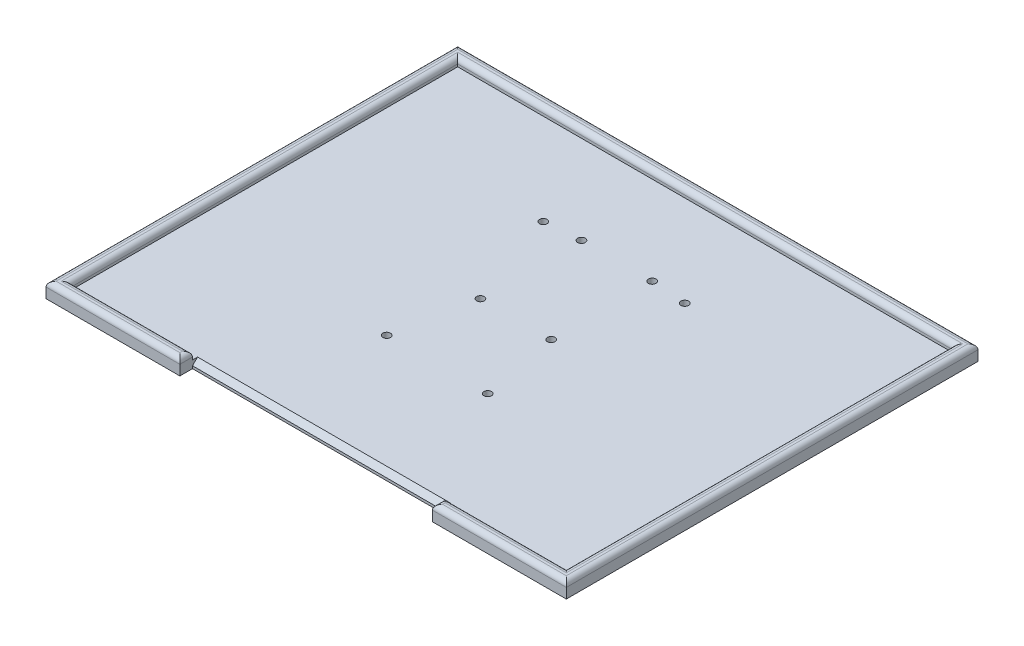
ISO-10303-21;
HEADER;
FILE_DESCRIPTION(('STEP AP214'),'2;1');
FILE_NAME('part.step','',(''),(''),'','','');
FILE_SCHEMA(('AUTOMOTIVE_DESIGN { 1 0 10303 214 1 1 1 1 }'));
ENDSEC;
DATA;
#1=APPLICATION_CONTEXT('core data for automotive mechanical design processes');
#2=APPLICATION_PROTOCOL_DEFINITION('international standard','automotive_design',2000,#1);
#3=PRODUCT_CONTEXT('',#1,'mechanical');
#4=PRODUCT('Part','Part','',(#3));
#5=PRODUCT_RELATED_PRODUCT_CATEGORY('part','',(#4));
#6=PRODUCT_DEFINITION_FORMATION('','',#4);
#7=PRODUCT_DEFINITION_CONTEXT('part definition',#1,'design');
#8=PRODUCT_DEFINITION('design','',#6,#7);
#9=PRODUCT_DEFINITION_SHAPE('','',#8);
#10=(LENGTH_UNIT() NAMED_UNIT(*) SI_UNIT(.MILLI.,.METRE.));
#11=(NAMED_UNIT(*) PLANE_ANGLE_UNIT() SI_UNIT($,.RADIAN.));
#12=(NAMED_UNIT(*) SI_UNIT($,.STERADIAN.) SOLID_ANGLE_UNIT());
#13=UNCERTAINTY_MEASURE_WITH_UNIT(LENGTH_MEASURE(1.E-05),#10,'distance_accuracy_value','');
#14=(GEOMETRIC_REPRESENTATION_CONTEXT(3) GLOBAL_UNCERTAINTY_ASSIGNED_CONTEXT((#13)) GLOBAL_UNIT_ASSIGNED_CONTEXT((#10,
#11,#12)) REPRESENTATION_CONTEXT('',''));
#15=CARTESIAN_POINT('',(0.,0.,0.));
#16=DIRECTION('',(0.,0.,1.));
#17=DIRECTION('',(1.,0.,0.));
#18=AXIS2_PLACEMENT_3D('',#15,#16,#17);
#19=CARTESIAN_POINT('',(0.,3.,0.));
#20=DIRECTION('',(0.,0.,-1.));
#21=DIRECTION('',(-1.,0.,0.));
#22=AXIS2_PLACEMENT_3D('',#19,#20,#21);
#23=PLANE('',#22);
#24=DIRECTION('',(0.,1.,0.));
#25=VECTOR('',#24,1.);
#26=CARTESIAN_POINT('',(53.,-4.,0.));
#27=LINE('',#26,#25);
#28=CARTESIAN_POINT('',(53.,0.,0.));
#29=VERTEX_POINT('',#28);
#30=CARTESIAN_POINT('',(53.,4.,0.));
#31=VERTEX_POINT('',#30);
#32=EDGE_CURVE('E492',#29,#31,#27,.T.);
#33=ORIENTED_EDGE('',*,*,#32,.T.);
#34=DIRECTION('',(1.,0.,0.));
#35=VECTOR('',#34,1.);
#36=CARTESIAN_POINT('',(0.,4.,0.));
#37=LINE('',#36,#35);
#38=CARTESIAN_POINT('',(0.,4.,0.));
#39=VERTEX_POINT('',#38);
#40=EDGE_CURVE('E442',#31,#39,#37,.F.);
#41=ORIENTED_EDGE('',*,*,#40,.T.);
#42=DIRECTION('',(0.,-1.,0.));
#43=VECTOR('',#42,1.);
#44=CARTESIAN_POINT('',(0.,3.,0.));
#45=LINE('',#44,#43);
#46=CARTESIAN_POINT('',(0.,0.,0.));
#47=VERTEX_POINT('',#46);
#48=EDGE_CURVE('E368',#39,#47,#45,.T.);
#49=ORIENTED_EDGE('',*,*,#48,.T.);
#50=DIRECTION('',(1.,0.,0.));
#51=VECTOR('',#50,1.);
#52=CARTESIAN_POINT('',(0.,0.,0.));
#53=LINE('',#52,#51);
#54=EDGE_CURVE('E347',#47,#29,#53,.T.);
#55=ORIENTED_EDGE('',*,*,#54,.T.);
#56=EDGE_LOOP('',(#33,#41,#49,#55));
#57=FACE_BOUND('',#56,.T.);
#58=ADVANCED_FACE('F136',(#57),#23,.F.);
#59=CARTESIAN_POINT('',(0.,6.,-5.));
#60=DIRECTION('',(0.,0.,-1.));
#61=DIRECTION('',(-1.,0.,0.));
#62=AXIS2_PLACEMENT_3D('',#59,#60,#61);
#63=PLANE('',#62);
#64=DIRECTION('',(0.,1.,0.));
#65=VECTOR('',#64,1.);
#66=CARTESIAN_POINT('',(5.00000000000002,6.,-5.));
#67=LINE('',#66,#65);
#68=CARTESIAN_POINT('',(5.00000000000002,3.,-5.));
#69=VERTEX_POINT('',#68);
#70=CARTESIAN_POINT('',(5.00000000000002,4.,-5.));
#71=VERTEX_POINT('',#70);
#72=EDGE_CURVE('E339',#69,#71,#67,.T.);
#73=ORIENTED_EDGE('',*,*,#72,.T.);
#74=DIRECTION('',(1.,0.,0.));
#75=VECTOR('',#74,1.);
#76=CARTESIAN_POINT('',(53.,4.,-5.));
#77=LINE('',#76,#75);
#78=CARTESIAN_POINT('',(53.,4.,-5.));
#79=VERTEX_POINT('',#78);
#80=EDGE_CURVE('E436',#71,#79,#77,.T.);
#81=ORIENTED_EDGE('',*,*,#80,.T.);
#82=DIRECTION('',(0.,1.,0.));
#83=VECTOR('',#82,1.);
#84=CARTESIAN_POINT('',(53.,-4.,-5.));
#85=LINE('',#84,#83);
#86=CARTESIAN_POINT('',(53.,3.,-5.));
#87=VERTEX_POINT('',#86);
#88=EDGE_CURVE('E297',#87,#79,#85,.T.);
#89=ORIENTED_EDGE('',*,*,#88,.F.);
#90=DIRECTION('',(1.,0.,0.));
#91=VECTOR('',#90,1.);
#92=CARTESIAN_POINT('',(0.,3.,-5.));
#93=LINE('',#92,#91);
#94=EDGE_CURVE('E327',#69,#87,#93,.T.);
#95=ORIENTED_EDGE('',*,*,#94,.F.);
#96=EDGE_LOOP('',(#73,#81,#89,#95));
#97=FACE_BOUND('',#96,.T.);
#98=ADVANCED_FACE('F552',(#97),#63,.T.);
#99=CARTESIAN_POINT('',(0.,3.,0.));
#100=DIRECTION('',(1.,0.,0.));
#101=DIRECTION('',(0.,0.,-1.));
#102=AXIS2_PLACEMENT_3D('',#99,#100,#101);
#103=PLANE('',#102);
#104=ORIENTED_EDGE('',*,*,#48,.F.);
#105=DIRECTION('',(0.,0.,1.));
#106=VECTOR('',#105,1.);
#107=CARTESIAN_POINT('',(0.,4.,0.));
#108=LINE('',#107,#106);
#109=CARTESIAN_POINT('',(0.,4.,-163.));
#110=VERTEX_POINT('',#109);
#111=EDGE_CURVE('E408',#39,#110,#108,.F.);
#112=ORIENTED_EDGE('',*,*,#111,.T.);
#113=DIRECTION('',(0.,-1.,0.));
#114=VECTOR('',#113,1.);
#115=CARTESIAN_POINT('',(0.,3.,-163.));
#116=LINE('',#115,#114);
#117=CARTESIAN_POINT('',(0.,0.,-163.));
#118=VERTEX_POINT('',#117);
#119=EDGE_CURVE('E359',#110,#118,#116,.T.);
#120=ORIENTED_EDGE('',*,*,#119,.T.);
#121=DIRECTION('',(0.,0.,1.));
#122=VECTOR('',#121,1.);
#123=CARTESIAN_POINT('',(0.,0.,0.));
#124=LINE('',#123,#122);
#125=EDGE_CURVE('E343',#118,#47,#124,.T.);
#126=ORIENTED_EDGE('',*,*,#125,.T.);
#127=EDGE_LOOP('',(#104,#112,#120,#126));
#128=FACE_BOUND('',#127,.T.);
#129=ADVANCED_FACE('F587',(#128),#103,.F.);
#130=DIRECTION('',(0.,-1.,0.));
#131=VECTOR('',#130,1.);
#132=CARTESIAN_POINT('',(206.,3.,0.));
#133=LINE('',#132,#131);
#134=CARTESIAN_POINT('',(206.,4.,0.));
#135=VERTEX_POINT('',#134);
#136=CARTESIAN_POINT('',(206.,0.,0.));
#137=VERTEX_POINT('',#136);
#138=EDGE_CURVE('E365',#135,#137,#133,.T.);
#139=ORIENTED_EDGE('',*,*,#138,.F.);
#140=DIRECTION('',(1.,0.,0.));
#141=VECTOR('',#140,1.);
#142=CARTESIAN_POINT('',(0.,4.,0.));
#143=LINE('',#142,#141);
#144=CARTESIAN_POINT('',(153.,4.,0.));
#145=VERTEX_POINT('',#144);
#146=EDGE_CURVE('E418',#135,#145,#143,.F.);
#147=ORIENTED_EDGE('',*,*,#146,.T.);
#148=DIRECTION('',(0.,1.,0.));
#149=VECTOR('',#148,1.);
#150=CARTESIAN_POINT('',(153.,-4.,0.));
#151=LINE('',#150,#149);
#152=CARTESIAN_POINT('',(153.,0.,0.));
#153=VERTEX_POINT('',#152);
#154=EDGE_CURVE('E562',#153,#145,#151,.T.);
#155=ORIENTED_EDGE('',*,*,#154,.F.);
#156=EDGE_CURVE('E304',#153,#137,#53,.T.);
#157=ORIENTED_EDGE('',*,*,#156,.T.);
#158=EDGE_LOOP('',(#139,#147,#155,#157));
#159=FACE_BOUND('',#158,.T.);
#160=ADVANCED_FACE('F599',(#159),#23,.F.);
#161=CARTESIAN_POINT('',(206.,3.,0.));
#162=DIRECTION('',(-1.,0.,0.));
#163=DIRECTION('',(0.,0.,1.));
#164=AXIS2_PLACEMENT_3D('',#161,#162,#163);
#165=PLANE('',#164);
#166=DIRECTION('',(0.,-1.,0.));
#167=VECTOR('',#166,1.);
#168=CARTESIAN_POINT('',(206.,3.,-163.));
#169=LINE('',#168,#167);
#170=CARTESIAN_POINT('',(206.,4.,-163.));
#171=VERTEX_POINT('',#170);
#172=CARTESIAN_POINT('',(206.,0.,-163.));
#173=VERTEX_POINT('',#172);
#174=EDGE_CURVE('E362',#171,#173,#169,.T.);
#175=ORIENTED_EDGE('',*,*,#174,.F.);
#176=DIRECTION('',(0.,0.,1.));
#177=VECTOR('',#176,1.);
#178=CARTESIAN_POINT('',(206.,4.,0.));
#179=LINE('',#178,#177);
#180=EDGE_CURVE('E415',#171,#135,#179,.T.);
#181=ORIENTED_EDGE('',*,*,#180,.T.);
#182=ORIENTED_EDGE('',*,*,#138,.T.);
#183=DIRECTION('',(0.,0.,-1.));
#184=VECTOR('',#183,1.);
#185=CARTESIAN_POINT('',(206.,0.,0.));
#186=LINE('',#185,#184);
#187=EDGE_CURVE('E351',#137,#173,#186,.T.);
#188=ORIENTED_EDGE('',*,*,#187,.T.);
#189=EDGE_LOOP('',(#175,#181,#182,#188));
#190=FACE_BOUND('',#189,.T.);
#191=ADVANCED_FACE('F628',(#190),#165,.F.);
#192=CARTESIAN_POINT('',(0.,3.,-163.));
#193=DIRECTION('',(0.,0.,1.));
#194=DIRECTION('',(1.,0.,0.));
#195=AXIS2_PLACEMENT_3D('',#192,#193,#194);
#196=PLANE('',#195);
#197=ORIENTED_EDGE('',*,*,#119,.F.);
#198=DIRECTION('',(1.,0.,0.));
#199=VECTOR('',#198,1.);
#200=CARTESIAN_POINT('',(0.,4.,-163.));
#201=LINE('',#200,#199);
#202=EDGE_CURVE('E412',#110,#171,#201,.T.);
#203=ORIENTED_EDGE('',*,*,#202,.T.);
#204=ORIENTED_EDGE('',*,*,#174,.T.);
#205=DIRECTION('',(-1.,0.,0.));
#206=VECTOR('',#205,1.);
#207=CARTESIAN_POINT('',(0.,0.,-163.));
#208=LINE('',#207,#206);
#209=EDGE_CURVE('E355',#173,#118,#208,.T.);
#210=ORIENTED_EDGE('',*,*,#209,.T.);
#211=EDGE_LOOP('',(#197,#203,#204,#210));
#212=FACE_BOUND('',#211,.T.);
#213=ADVANCED_FACE('F589',(#212),#196,.F.);
#214=CARTESIAN_POINT('',(0.,0.,0.));
#215=DIRECTION('',(0.,-1.,0.));
#216=DIRECTION('',(0.,0.,-1.));
#217=AXIS2_PLACEMENT_3D('',#214,#215,#216);
#218=PLANE('',#217);
#219=CARTESIAN_POINT('',(117.,0.,-123.));
#220=DIRECTION('',(0.,-1.,0.));
#221=DIRECTION('',(0.,0.,-1.));
#222=AXIS2_PLACEMENT_3D('',#219,#220,#221);
#223=CIRCLE('',#222,1.5);
#224=CARTESIAN_POINT('',(117.,0.,-124.5));
#225=VERTEX_POINT('',#224);
#226=EDGE_CURVE('E996',#225,#225,#223,.T.);
#227=ORIENTED_EDGE('',*,*,#226,.F.);
#228=EDGE_LOOP('',(#227));
#229=FACE_BOUND('',#228,.T.);
#230=CARTESIAN_POINT('',(89.,0.,-83.));
#231=DIRECTION('',(0.,-1.,0.));
#232=DIRECTION('',(0.,0.,-1.));
#233=AXIS2_PLACEMENT_3D('',#230,#231,#232);
#234=CIRCLE('',#233,1.5);
#235=CARTESIAN_POINT('',(89.,0.,-84.5));
#236=VERTEX_POINT('',#235);
#237=EDGE_CURVE('E1021',#236,#236,#234,.T.);
#238=ORIENTED_EDGE('',*,*,#237,.F.);
#239=EDGE_LOOP('',(#238));
#240=FACE_BOUND('',#239,.T.);
#241=CARTESIAN_POINT('',(117.,0.,-83.));
#242=DIRECTION('',(0.,-1.,0.));
#243=DIRECTION('',(0.,0.,-1.));
#244=AXIS2_PLACEMENT_3D('',#241,#242,#243);
#245=CIRCLE('',#244,1.5);
#246=CARTESIAN_POINT('',(117.,0.,-84.5));
#247=VERTEX_POINT('',#246);
#248=EDGE_CURVE('E1017',#247,#247,#245,.T.);
#249=ORIENTED_EDGE('',*,*,#248,.F.);
#250=EDGE_LOOP('',(#249));
#251=FACE_BOUND('',#250,.T.);
#252=CARTESIAN_POINT('',(89.,0.,-123.));
#253=DIRECTION('',(0.,-1.,0.));
#254=DIRECTION('',(0.,0.,-1.));
#255=AXIS2_PLACEMENT_3D('',#252,#253,#254);
#256=CIRCLE('',#255,1.5);
#257=CARTESIAN_POINT('',(89.,0.,-124.5));
#258=VERTEX_POINT('',#257);
#259=EDGE_CURVE('E1007',#258,#258,#256,.T.);
#260=ORIENTED_EDGE('',*,*,#259,.F.);
#261=EDGE_LOOP('',(#260));
#262=FACE_BOUND('',#261,.T.);
#263=CARTESIAN_POINT('',(131.,0.,-121.880300889544));
#264=DIRECTION('',(0.,-1.,0.));
#265=DIRECTION('',(0.,0.,-1.));
#266=AXIS2_PLACEMENT_3D('',#263,#264,#265);
#267=CIRCLE('',#266,1.5);
#268=CARTESIAN_POINT('',(131.,0.,-123.380300889544));
#269=VERTEX_POINT('',#268);
#270=EDGE_CURVE('E449',#269,#269,#267,.T.);
#271=ORIENTED_EDGE('',*,*,#270,.F.);
#272=EDGE_LOOP('',(#271));
#273=FACE_BOUND('',#272,.T.);
#274=CARTESIAN_POINT('',(75.,0.,-121.880300889544));
#275=DIRECTION('',(0.,-1.,0.));
#276=DIRECTION('',(0.,0.,-1.));
#277=AXIS2_PLACEMENT_3D('',#274,#275,#276);
#278=CIRCLE('',#277,1.5);
#279=CARTESIAN_POINT('',(75.,0.,-123.380300889544));
#280=VERTEX_POINT('',#279);
#281=EDGE_CURVE('E1049',#280,#280,#278,.T.);
#282=ORIENTED_EDGE('',*,*,#281,.F.);
#283=EDGE_LOOP('',(#282));
#284=FACE_BOUND('',#283,.T.);
#285=CARTESIAN_POINT('',(83.,0.,-51.8803008895443));
#286=DIRECTION('',(0.,-1.,0.));
#287=DIRECTION('',(0.,0.,-1.));
#288=AXIS2_PLACEMENT_3D('',#285,#286,#287);
#289=CIRCLE('',#288,1.5);
#290=CARTESIAN_POINT('',(83.,0.,-53.3803008895443));
#291=VERTEX_POINT('',#290);
#292=EDGE_CURVE('E1046',#291,#291,#289,.T.);
#293=ORIENTED_EDGE('',*,*,#292,.F.);
#294=EDGE_LOOP('',(#293));
#295=FACE_BOUND('',#294,.T.);
#296=CARTESIAN_POINT('',(123.,0.,-51.8803008895443));
#297=DIRECTION('',(0.,-1.,0.));
#298=DIRECTION('',(0.,0.,-1.));
#299=AXIS2_PLACEMENT_3D('',#296,#297,#298);
#300=CIRCLE('',#299,1.5);
#301=CARTESIAN_POINT('',(123.,0.,-53.3803008895443));
#302=VERTEX_POINT('',#301);
#303=EDGE_CURVE('E1043',#302,#302,#300,.T.);
#304=ORIENTED_EDGE('',*,*,#303,.F.);
#305=EDGE_LOOP('',(#304));
#306=FACE_BOUND('',#305,.T.);
#307=DIRECTION('',(0.,0.,-1.));
#308=VECTOR('',#307,1.);
#309=CARTESIAN_POINT('',(53.,0.,0.));
#310=LINE('',#309,#308);
#311=CARTESIAN_POINT('',(53.,0.,-5.));
#312=VERTEX_POINT('',#311);
#313=EDGE_CURVE('E306',#29,#312,#310,.T.);
#314=ORIENTED_EDGE('',*,*,#313,.F.);
#315=ORIENTED_EDGE('',*,*,#54,.F.);
#316=ORIENTED_EDGE('',*,*,#125,.F.);
#317=ORIENTED_EDGE('',*,*,#209,.F.);
#318=ORIENTED_EDGE('',*,*,#187,.F.);
#319=ORIENTED_EDGE('',*,*,#156,.F.);
#320=DIRECTION('',(0.,0.,1.));
#321=VECTOR('',#320,1.);
#322=CARTESIAN_POINT('',(153.,0.,0.));
#323=LINE('',#322,#321);
#324=CARTESIAN_POINT('',(153.,0.,-5.));
#325=VERTEX_POINT('',#324);
#326=EDGE_CURVE('E289',#325,#153,#323,.T.);
#327=ORIENTED_EDGE('',*,*,#326,.F.);
#328=DIRECTION('',(1.,0.,0.));
#329=VECTOR('',#328,1.);
#330=CARTESIAN_POINT('',(0.,0.,-5.));
#331=LINE('',#330,#329);
#332=EDGE_CURVE('E280',#312,#325,#331,.T.);
#333=ORIENTED_EDGE('',*,*,#332,.F.);
#334=EDGE_LOOP('',(#314,#315,#316,#317,#318,#319,#327,#333));
#335=FACE_BOUND('',#334,.T.);
#336=ADVANCED_FACE('F301',(#229,#240,#251,#262,#273,#284,#295,#306,#335),#218,.T.);
#337=CARTESIAN_POINT('',(0.,6.,0.));
#338=DIRECTION('',(0.,-1.,0.));
#339=DIRECTION('',(0.,0.,-1.));
#340=AXIS2_PLACEMENT_3D('',#337,#338,#339);
#341=PLANE('',#340);
#342=DIRECTION('',(1.,0.,0.));
#343=VECTOR('',#342,1.);
#344=CARTESIAN_POINT('',(0.,6.,-161.));
#345=LINE('',#344,#343);
#346=CARTESIAN_POINT('',(204.,6.,-161.));
#347=VERTEX_POINT('',#346);
#348=CARTESIAN_POINT('',(2.,6.,-161.));
#349=VERTEX_POINT('',#348);
#350=EDGE_CURVE('E401',#347,#349,#345,.F.);
#351=ORIENTED_EDGE('',*,*,#350,.T.);
#352=DIRECTION('',(0.,0.,1.));
#353=VECTOR('',#352,1.);
#354=CARTESIAN_POINT('',(2.,6.,0.));
#355=LINE('',#354,#353);
#356=CARTESIAN_POINT('',(2.,6.,-2.));
#357=VERTEX_POINT('',#356);
#358=EDGE_CURVE('E404',#349,#357,#355,.T.);
#359=ORIENTED_EDGE('',*,*,#358,.T.);
#360=DIRECTION('',(1.,0.,0.));
#361=VECTOR('',#360,1.);
#362=CARTESIAN_POINT('',(0.,6.,-2.));
#363=LINE('',#362,#361);
#364=CARTESIAN_POINT('',(51.,6.,-2.));
#365=VERTEX_POINT('',#364);
#366=EDGE_CURVE('E371',#357,#365,#363,.T.);
#367=ORIENTED_EDGE('',*,*,#366,.T.);
#368=DIRECTION('',(0.,0.,1.));
#369=VECTOR('',#368,1.);
#370=CARTESIAN_POINT('',(51.,6.,0.));
#371=LINE('',#370,#369);
#372=CARTESIAN_POINT('',(51.,6.,-3.));
#373=VERTEX_POINT('',#372);
#374=EDGE_CURVE('E374',#365,#373,#371,.F.);
#375=ORIENTED_EDGE('',*,*,#374,.T.);
#376=DIRECTION('',(1.,0.,0.));
#377=VECTOR('',#376,1.);
#378=CARTESIAN_POINT('',(5.00000000000002,6.,-3.));
#379=LINE('',#378,#377);
#380=CARTESIAN_POINT('',(3.00000000000002,6.,-3.));
#381=VERTEX_POINT('',#380);
#382=EDGE_CURVE('E377',#373,#381,#379,.F.);
#383=ORIENTED_EDGE('',*,*,#382,.T.);
#384=DIRECTION('',(0.,0.,1.));
#385=VECTOR('',#384,1.);
#386=CARTESIAN_POINT('',(3.,6.,-158.));
#387=LINE('',#386,#385);
#388=CARTESIAN_POINT('',(3.,6.,-160.));
#389=VERTEX_POINT('',#388);
#390=EDGE_CURVE('E380',#381,#389,#387,.F.);
#391=ORIENTED_EDGE('',*,*,#390,.T.);
#392=DIRECTION('',(1.,0.,0.));
#393=VECTOR('',#392,1.);
#394=CARTESIAN_POINT('',(0.,6.,-160.));
#395=LINE('',#394,#393);
#396=CARTESIAN_POINT('',(203.,6.,-160.));
#397=VERTEX_POINT('',#396);
#398=EDGE_CURVE('E383',#389,#397,#395,.T.);
#399=ORIENTED_EDGE('',*,*,#398,.T.);
#400=DIRECTION('',(0.,0.,1.));
#401=VECTOR('',#400,1.);
#402=CARTESIAN_POINT('',(203.,6.,0.));
#403=LINE('',#402,#401);
#404=CARTESIAN_POINT('',(203.,6.,-3.));
#405=VERTEX_POINT('',#404);
#406=EDGE_CURVE('E386',#397,#405,#403,.T.);
#407=ORIENTED_EDGE('',*,*,#406,.T.);
#408=DIRECTION('',(1.,0.,0.));
#409=VECTOR('',#408,1.);
#410=CARTESIAN_POINT('',(153.,6.,-3.));
#411=LINE('',#410,#409);
#412=CARTESIAN_POINT('',(155.,6.,-3.));
#413=VERTEX_POINT('',#412);
#414=EDGE_CURVE('E389',#405,#413,#411,.F.);
#415=ORIENTED_EDGE('',*,*,#414,.T.);
#416=DIRECTION('',(0.,0.,-1.));
#417=VECTOR('',#416,1.);
#418=CARTESIAN_POINT('',(155.,6.,0.));
#419=LINE('',#418,#417);
#420=CARTESIAN_POINT('',(155.,6.,-2.));
#421=VERTEX_POINT('',#420);
#422=EDGE_CURVE('E392',#413,#421,#419,.F.);
#423=ORIENTED_EDGE('',*,*,#422,.T.);
#424=DIRECTION('',(1.,0.,0.));
#425=VECTOR('',#424,1.);
#426=CARTESIAN_POINT('',(0.,6.,-2.));
#427=LINE('',#426,#425);
#428=CARTESIAN_POINT('',(204.,6.,-2.));
#429=VERTEX_POINT('',#428);
#430=EDGE_CURVE('E395',#421,#429,#427,.T.);
#431=ORIENTED_EDGE('',*,*,#430,.T.);
#432=DIRECTION('',(0.,0.,1.));
#433=VECTOR('',#432,1.);
#434=CARTESIAN_POINT('',(204.,6.,0.));
#435=LINE('',#434,#433);
#436=EDGE_CURVE('E398',#429,#347,#435,.F.);
#437=ORIENTED_EDGE('',*,*,#436,.T.);
#438=EDGE_LOOP('',(#351,#359,#367,#375,#383,#391,#399,#407,#415,#423,#431,#437));
#439=FACE_BOUND('',#438,.T.);
#440=ADVANCED_FACE('F533',(#439),#341,.F.);
#441=CARTESIAN_POINT('',(5.,6.,-163.));
#442=DIRECTION('',(1.,0.,0.));
#443=DIRECTION('',(0.,0.,-1.));
#444=AXIS2_PLACEMENT_3D('',#441,#442,#443);
#445=PLANE('',#444);
#446=DIRECTION('',(0.,1.,0.));
#447=VECTOR('',#446,1.);
#448=CARTESIAN_POINT('',(5.,6.,-158.));
#449=LINE('',#448,#447);
#450=CARTESIAN_POINT('',(5.,3.,-158.));
#451=VERTEX_POINT('',#450);
#452=CARTESIAN_POINT('',(5.,4.,-158.));
#453=VERTEX_POINT('',#452);
#454=EDGE_CURVE('E317',#451,#453,#449,.T.);
#455=ORIENTED_EDGE('',*,*,#454,.T.);
#456=DIRECTION('',(0.,0.,1.));
#457=VECTOR('',#456,1.);
#458=CARTESIAN_POINT('',(5.00000000000002,4.,-5.));
#459=LINE('',#458,#457);
#460=EDGE_CURVE('E433',#453,#71,#459,.T.);
#461=ORIENTED_EDGE('',*,*,#460,.T.);
#462=ORIENTED_EDGE('',*,*,#72,.F.);
#463=DIRECTION('',(0.,0.,1.));
#464=VECTOR('',#463,1.);
#465=CARTESIAN_POINT('',(5.,3.,-163.));
#466=LINE('',#465,#464);
#467=EDGE_CURVE('E313',#451,#69,#466,.T.);
#468=ORIENTED_EDGE('',*,*,#467,.F.);
#469=EDGE_LOOP('',(#455,#461,#462,#468));
#470=FACE_BOUND('',#469,.T.);
#471=ADVANCED_FACE('F547',(#470),#445,.T.);
#472=CARTESIAN_POINT('',(201.,6.,-163.));
#473=DIRECTION('',(1.,0.,0.));
#474=DIRECTION('',(0.,0.,-1.));
#475=AXIS2_PLACEMENT_3D('',#472,#473,#474);
#476=PLANE('',#475);
#477=DIRECTION('',(0.,1.,0.));
#478=VECTOR('',#477,1.);
#479=CARTESIAN_POINT('',(201.,6.,-5.));
#480=LINE('',#479,#478);
#481=CARTESIAN_POINT('',(201.,3.,-5.));
#482=VERTEX_POINT('',#481);
#483=CARTESIAN_POINT('',(201.,4.,-5.));
#484=VERTEX_POINT('',#483);
#485=EDGE_CURVE('E323',#482,#484,#480,.T.);
#486=ORIENTED_EDGE('',*,*,#485,.T.);
#487=DIRECTION('',(0.,0.,1.));
#488=VECTOR('',#487,1.);
#489=CARTESIAN_POINT('',(201.,4.,-163.));
#490=LINE('',#489,#488);
#491=CARTESIAN_POINT('',(201.,4.,-158.));
#492=VERTEX_POINT('',#491);
#493=EDGE_CURVE('E427',#484,#492,#490,.F.);
#494=ORIENTED_EDGE('',*,*,#493,.T.);
#495=DIRECTION('',(0.,1.,0.));
#496=VECTOR('',#495,1.);
#497=CARTESIAN_POINT('',(201.,6.,-158.));
#498=LINE('',#497,#496);
#499=CARTESIAN_POINT('',(201.,3.,-158.));
#500=VERTEX_POINT('',#499);
#501=EDGE_CURVE('E318',#500,#492,#498,.T.);
#502=ORIENTED_EDGE('',*,*,#501,.F.);
#503=DIRECTION('',(0.,0.,1.));
#504=VECTOR('',#503,1.);
#505=CARTESIAN_POINT('',(201.,3.,-163.));
#506=LINE('',#505,#504);
#507=EDGE_CURVE('E319',#500,#482,#506,.T.);
#508=ORIENTED_EDGE('',*,*,#507,.T.);
#509=EDGE_LOOP('',(#486,#494,#502,#508));
#510=FACE_BOUND('',#509,.T.);
#511=ADVANCED_FACE('F517',(#510),#476,.F.);
#512=CARTESIAN_POINT('',(0.,6.,-158.));
#513=DIRECTION('',(0.,0.,-1.));
#514=DIRECTION('',(-1.,0.,0.));
#515=AXIS2_PLACEMENT_3D('',#512,#513,#514);
#516=PLANE('',#515);
#517=ORIENTED_EDGE('',*,*,#501,.T.);
#518=DIRECTION('',(1.,0.,0.));
#519=VECTOR('',#518,1.);
#520=CARTESIAN_POINT('',(0.,4.,-158.));
#521=LINE('',#520,#519);
#522=EDGE_CURVE('E430',#492,#453,#521,.F.);
#523=ORIENTED_EDGE('',*,*,#522,.T.);
#524=ORIENTED_EDGE('',*,*,#454,.F.);
#525=DIRECTION('',(1.,0.,0.));
#526=VECTOR('',#525,1.);
#527=CARTESIAN_POINT('',(0.,3.,-158.));
#528=LINE('',#527,#526);
#529=EDGE_CURVE('E324',#451,#500,#528,.T.);
#530=ORIENTED_EDGE('',*,*,#529,.T.);
#531=EDGE_LOOP('',(#517,#523,#524,#530));
#532=FACE_BOUND('',#531,.T.);
#533=ADVANCED_FACE('F542',(#532),#516,.F.);
#534=DIRECTION('',(0.,1.,0.));
#535=VECTOR('',#534,1.);
#536=CARTESIAN_POINT('',(153.,-4.,-5.));
#537=LINE('',#536,#535);
#538=CARTESIAN_POINT('',(153.,3.,-5.));
#539=VERTEX_POINT('',#538);
#540=CARTESIAN_POINT('',(153.,4.,-5.));
#541=VERTEX_POINT('',#540);
#542=EDGE_CURVE('E298',#539,#541,#537,.T.);
#543=ORIENTED_EDGE('',*,*,#542,.T.);
#544=DIRECTION('',(1.,0.,0.));
#545=VECTOR('',#544,1.);
#546=CARTESIAN_POINT('',(201.,4.,-5.));
#547=LINE('',#546,#545);
#548=EDGE_CURVE('E424',#541,#484,#547,.T.);
#549=ORIENTED_EDGE('',*,*,#548,.T.);
#550=ORIENTED_EDGE('',*,*,#485,.F.);
#551=EDGE_CURVE('E309',#539,#482,#93,.T.);
#552=ORIENTED_EDGE('',*,*,#551,.F.);
#553=EDGE_LOOP('',(#543,#549,#550,#552));
#554=FACE_BOUND('',#553,.T.);
#555=ADVANCED_FACE('F519',(#554),#63,.T.);
#556=CARTESIAN_POINT('',(0.,3.,0.));
#557=DIRECTION('',(0.,-1.,0.));
#558=DIRECTION('',(0.,0.,-1.));
#559=AXIS2_PLACEMENT_3D('',#556,#557,#558);
#560=PLANE('',#559);
#561=CARTESIAN_POINT('',(117.,3.,-123.));
#562=DIRECTION('',(0.,1.,0.));
#563=DIRECTION('',(0.,0.,1.));
#564=AXIS2_PLACEMENT_3D('',#561,#562,#563);
#565=CIRCLE('',#564,1.5);
#566=CARTESIAN_POINT('',(117.,3.,-121.5));
#567=VERTEX_POINT('',#566);
#568=EDGE_CURVE('E999',#567,#567,#565,.T.);
#569=ORIENTED_EDGE('',*,*,#568,.F.);
#570=EDGE_LOOP('',(#569));
#571=FACE_BOUND('',#570,.T.);
#572=CARTESIAN_POINT('',(89.,3.,-83.));
#573=DIRECTION('',(0.,1.,0.));
#574=DIRECTION('',(0.,0.,1.));
#575=AXIS2_PLACEMENT_3D('',#572,#573,#574);
#576=CIRCLE('',#575,1.5);
#577=CARTESIAN_POINT('',(89.,3.,-81.5));
#578=VERTEX_POINT('',#577);
#579=EDGE_CURVE('E1002',#578,#578,#576,.T.);
#580=ORIENTED_EDGE('',*,*,#579,.F.);
#581=EDGE_LOOP('',(#580));
#582=FACE_BOUND('',#581,.T.);
#583=CARTESIAN_POINT('',(117.,3.,-83.));
#584=DIRECTION('',(0.,1.,0.));
#585=DIRECTION('',(0.,0.,1.));
#586=AXIS2_PLACEMENT_3D('',#583,#584,#585);
#587=CIRCLE('',#586,1.5);
#588=CARTESIAN_POINT('',(117.,3.,-81.5));
#589=VERTEX_POINT('',#588);
#590=EDGE_CURVE('E1010',#589,#589,#587,.T.);
#591=ORIENTED_EDGE('',*,*,#590,.F.);
#592=EDGE_LOOP('',(#591));
#593=FACE_BOUND('',#592,.T.);
#594=CARTESIAN_POINT('',(89.,3.,-123.));
#595=DIRECTION('',(0.,1.,0.));
#596=DIRECTION('',(0.,0.,1.));
#597=AXIS2_PLACEMENT_3D('',#594,#595,#596);
#598=CIRCLE('',#597,1.5);
#599=CARTESIAN_POINT('',(89.,3.,-121.5));
#600=VERTEX_POINT('',#599);
#601=EDGE_CURVE('E1001',#600,#600,#598,.T.);
#602=ORIENTED_EDGE('',*,*,#601,.F.);
#603=EDGE_LOOP('',(#602));
#604=FACE_BOUND('',#603,.T.);
#605=CARTESIAN_POINT('',(131.,3.,-121.880300889544));
#606=DIRECTION('',(0.,1.,0.));
#607=DIRECTION('',(0.,0.,1.));
#608=AXIS2_PLACEMENT_3D('',#605,#606,#607);
#609=CIRCLE('',#608,1.5);
#610=CARTESIAN_POINT('',(131.,3.,-120.380300889544));
#611=VERTEX_POINT('',#610);
#612=EDGE_CURVE('E1027',#611,#611,#609,.T.);
#613=ORIENTED_EDGE('',*,*,#612,.F.);
#614=EDGE_LOOP('',(#613));
#615=FACE_BOUND('',#614,.T.);
#616=CARTESIAN_POINT('',(75.,3.,-121.880300889544));
#617=DIRECTION('',(0.,1.,0.));
#618=DIRECTION('',(0.,0.,1.));
#619=AXIS2_PLACEMENT_3D('',#616,#617,#618);
#620=CIRCLE('',#619,1.5);
#621=CARTESIAN_POINT('',(75.,3.,-120.380300889544));
#622=VERTEX_POINT('',#621);
#623=EDGE_CURVE('E1033',#622,#622,#620,.T.);
#624=ORIENTED_EDGE('',*,*,#623,.F.);
#625=EDGE_LOOP('',(#624));
#626=FACE_BOUND('',#625,.T.);
#627=CARTESIAN_POINT('',(83.,3.,-51.8803008895443));
#628=DIRECTION('',(0.,1.,0.));
#629=DIRECTION('',(0.,0.,1.));
#630=AXIS2_PLACEMENT_3D('',#627,#628,#629);
#631=CIRCLE('',#630,1.5);
#632=CARTESIAN_POINT('',(83.,3.,-50.3803008895443));
#633=VERTEX_POINT('',#632);
#634=EDGE_CURVE('E1028',#633,#633,#631,.T.);
#635=ORIENTED_EDGE('',*,*,#634,.F.);
#636=EDGE_LOOP('',(#635));
#637=FACE_BOUND('',#636,.T.);
#638=CARTESIAN_POINT('',(123.,3.,-51.8803008895443));
#639=DIRECTION('',(0.,1.,0.));
#640=DIRECTION('',(0.,0.,1.));
#641=AXIS2_PLACEMENT_3D('',#638,#639,#640);
#642=CIRCLE('',#641,1.5);
#643=CARTESIAN_POINT('',(123.,3.,-50.3803008895443));
#644=VERTEX_POINT('',#643);
#645=EDGE_CURVE('E1032',#644,#644,#642,.T.);
#646=ORIENTED_EDGE('',*,*,#645,.F.);
#647=EDGE_LOOP('',(#646));
#648=FACE_BOUND('',#647,.T.);
#649=DIRECTION('',(1.,0.,0.));
#650=VECTOR('',#649,1.);
#651=CARTESIAN_POINT('',(0.,3.,-7.));
#652=LINE('',#651,#650);
#653=CARTESIAN_POINT('',(53.,3.,-7.));
#654=VERTEX_POINT('',#653);
#655=CARTESIAN_POINT('',(153.,3.,-7.));
#656=VERTEX_POINT('',#655);
#657=EDGE_CURVE('E495',#654,#656,#652,.T.);
#658=ORIENTED_EDGE('',*,*,#657,.T.);
#659=DIRECTION('',(0.,0.,1.));
#660=VECTOR('',#659,1.);
#661=CARTESIAN_POINT('',(153.,3.,0.));
#662=LINE('',#661,#660);
#663=EDGE_CURVE('E499',#656,#539,#662,.T.);
#664=ORIENTED_EDGE('',*,*,#663,.T.);
#665=ORIENTED_EDGE('',*,*,#551,.T.);
#666=ORIENTED_EDGE('',*,*,#507,.F.);
#667=ORIENTED_EDGE('',*,*,#529,.F.);
#668=ORIENTED_EDGE('',*,*,#467,.T.);
#669=ORIENTED_EDGE('',*,*,#94,.T.);
#670=DIRECTION('',(0.,0.,-1.));
#671=VECTOR('',#670,1.);
#672=CARTESIAN_POINT('',(53.,3.,0.));
#673=LINE('',#672,#671);
#674=EDGE_CURVE('E151',#87,#654,#673,.T.);
#675=ORIENTED_EDGE('',*,*,#674,.T.);
#676=EDGE_LOOP('',(#658,#664,#665,#666,#667,#668,#669,#675));
#677=FACE_BOUND('',#676,.T.);
#678=ADVANCED_FACE('F509',(#571,#582,#593,#604,#615,#626,#637,#648,#677),#560,.F.);
#679=CARTESIAN_POINT('',(53.,-4.,-5.));
#680=DIRECTION('',(0.,0.,-1.));
#681=DIRECTION('',(-1.,0.,0.));
#682=AXIS2_PLACEMENT_3D('',#679,#680,#681);
#683=PLANE('',#682);
#684=CARTESIAN_POINT('',(153.,0.999999999999998,-5.));
#685=VERTEX_POINT('',#684);
#686=EDGE_CURVE('E283',#325,#685,#537,.T.);
#687=ORIENTED_EDGE('',*,*,#686,.T.);
#688=DIRECTION('',(-1.,0.,0.));
#689=VECTOR('',#688,1.);
#690=CARTESIAN_POINT('',(53.,0.999999999999998,-5.));
#691=LINE('',#690,#689);
#692=CARTESIAN_POINT('',(53.,0.999999999999998,-5.));
#693=VERTEX_POINT('',#692);
#694=EDGE_CURVE('E159',#685,#693,#691,.T.);
#695=ORIENTED_EDGE('',*,*,#694,.T.);
#696=EDGE_CURVE('E284',#312,#693,#85,.T.);
#697=ORIENTED_EDGE('',*,*,#696,.F.);
#698=ORIENTED_EDGE('',*,*,#332,.T.);
#699=EDGE_LOOP('',(#687,#695,#697,#698));
#700=FACE_BOUND('',#699,.T.);
#701=ADVANCED_FACE('F282',(#700),#683,.F.);
#702=CARTESIAN_POINT('',(53.,-4.,0.));
#703=DIRECTION('',(-1.,0.,0.));
#704=DIRECTION('',(0.,0.,1.));
#705=AXIS2_PLACEMENT_3D('',#702,#703,#704);
#706=PLANE('',#705);
#707=ORIENTED_EDGE('',*,*,#88,.T.);
#708=DIRECTION('',(0.,0.,1.));
#709=VECTOR('',#708,1.);
#710=CARTESIAN_POINT('',(53.,4.,0.));
#711=LINE('',#710,#709);
#712=EDGE_CURVE('E439',#79,#31,#711,.T.);
#713=ORIENTED_EDGE('',*,*,#712,.T.);
#714=ORIENTED_EDGE('',*,*,#32,.F.);
#715=ORIENTED_EDGE('',*,*,#313,.T.);
#716=ORIENTED_EDGE('',*,*,#696,.T.);
#717=DIRECTION('',(0.,-0.707106781186548,0.707106781186548));
#718=VECTOR('',#717,1.);
#719=CARTESIAN_POINT('',(53.,-4.,0.));
#720=LINE('',#719,#718);
#721=EDGE_CURVE('E12',#693,#654,#720,.F.);
#722=ORIENTED_EDGE('',*,*,#721,.T.);
#723=ORIENTED_EDGE('',*,*,#674,.F.);
#724=EDGE_LOOP('',(#707,#713,#714,#715,#716,#722,#723));
#725=FACE_BOUND('',#724,.T.);
#726=ADVANCED_FACE('F593',(#725),#706,.F.);
#727=CARTESIAN_POINT('',(153.,-4.,0.));
#728=DIRECTION('',(1.,0.,0.));
#729=DIRECTION('',(0.,0.,-1.));
#730=AXIS2_PLACEMENT_3D('',#727,#728,#729);
#731=PLANE('',#730);
#732=ORIENTED_EDGE('',*,*,#154,.T.);
#733=DIRECTION('',(0.,0.,-1.));
#734=VECTOR('',#733,1.);
#735=CARTESIAN_POINT('',(153.,4.,0.));
#736=LINE('',#735,#734);
#737=EDGE_CURVE('E421',#145,#541,#736,.T.);
#738=ORIENTED_EDGE('',*,*,#737,.T.);
#739=ORIENTED_EDGE('',*,*,#542,.F.);
#740=ORIENTED_EDGE('',*,*,#663,.F.);
#741=DIRECTION('',(0.,0.707106781186548,-0.707106781186548));
#742=VECTOR('',#741,1.);
#743=CARTESIAN_POINT('',(153.,-4.,0.));
#744=LINE('',#743,#742);
#745=EDGE_CURVE('E145',#656,#685,#744,.F.);
#746=ORIENTED_EDGE('',*,*,#745,.T.);
#747=ORIENTED_EDGE('',*,*,#686,.F.);
#748=ORIENTED_EDGE('',*,*,#326,.T.);
#749=EDGE_LOOP('',(#732,#738,#739,#740,#746,#747,#748));
#750=FACE_BOUND('',#749,.T.);
#751=ADVANCED_FACE('F293',(#750),#731,.F.);
#752=CARTESIAN_POINT('',(203.,4.,0.));
#753=DIRECTION('',(0.,0.,1.));
#754=DIRECTION('',(1.,0.,0.));
#755=AXIS2_PLACEMENT_3D('',#752,#753,#754);
#756=CYLINDRICAL_SURFACE('',#755,2.);
#757=CARTESIAN_POINT('',(203.,4.,-160.));
#758=DIRECTION('',(0.707106781186548,0.,0.707106781186547));
#759=DIRECTION('',(-0.707106781186547,0.,0.707106781186548));
#760=AXIS2_PLACEMENT_3D('',#757,#758,#759);
#761=ELLIPSE('',#760,2.82842712474619,2.);
#762=EDGE_CURVE('E484',#492,#397,#761,.F.);
#763=ORIENTED_EDGE('',*,*,#762,.F.);
#764=ORIENTED_EDGE('',*,*,#493,.F.);
#765=CARTESIAN_POINT('',(203.,4.,-3.));
#766=DIRECTION('',(-0.707106781186547,0.,0.707106781186548));
#767=DIRECTION('',(-0.707106781186548,0.,-0.707106781186547));
#768=AXIS2_PLACEMENT_3D('',#765,#766,#767);
#769=ELLIPSE('',#768,2.82842712474619,2.);
#770=EDGE_CURVE('E488',#405,#484,#769,.T.);
#771=ORIENTED_EDGE('',*,*,#770,.F.);
#772=ORIENTED_EDGE('',*,*,#406,.F.);
#773=EDGE_LOOP('',(#763,#764,#771,#772));
#774=FACE_BOUND('',#773,.T.);
#775=ADVANCED_FACE('F539',(#774),#756,.T.);
#776=CARTESIAN_POINT('',(0.,4.,-3.));
#777=DIRECTION('',(-1.,0.,0.));
#778=DIRECTION('',(0.,0.,1.));
#779=AXIS2_PLACEMENT_3D('',#776,#777,#778);
#780=CYLINDRICAL_SURFACE('',#779,2.);
#781=ORIENTED_EDGE('',*,*,#770,.T.);
#782=ORIENTED_EDGE('',*,*,#548,.F.);
#783=CARTESIAN_POINT('',(155.,4.,-3.));
#784=DIRECTION('',(-0.707106781186547,0.,0.707106781186547));
#785=DIRECTION('',(-0.707106781186547,0.,-0.707106781186547));
#786=AXIS2_PLACEMENT_3D('',#783,#784,#785);
#787=ELLIPSE('',#786,2.82842712474619,2.);
#788=EDGE_CURVE('E480',#413,#541,#787,.T.);
#789=ORIENTED_EDGE('',*,*,#788,.F.);
#790=ORIENTED_EDGE('',*,*,#414,.F.);
#791=EDGE_LOOP('',(#781,#782,#789,#790));
#792=FACE_BOUND('',#791,.T.);
#793=ADVANCED_FACE('F523',(#792),#780,.T.);
#794=CARTESIAN_POINT('',(0.,4.,-160.));
#795=DIRECTION('',(1.,0.,0.));
#796=DIRECTION('',(0.,0.,-1.));
#797=AXIS2_PLACEMENT_3D('',#794,#795,#796);
#798=CYLINDRICAL_SURFACE('',#797,2.);
#799=ORIENTED_EDGE('',*,*,#762,.T.);
#800=ORIENTED_EDGE('',*,*,#398,.F.);
#801=CARTESIAN_POINT('',(3.,4.,-160.));
#802=DIRECTION('',(0.707106781186547,0.,-0.707106781186548));
#803=DIRECTION('',(0.707106781186548,0.,0.707106781186547));
#804=AXIS2_PLACEMENT_3D('',#801,#802,#803);
#805=ELLIPSE('',#804,2.82842712474619,2.);
#806=EDGE_CURVE('E476',#453,#389,#805,.F.);
#807=ORIENTED_EDGE('',*,*,#806,.F.);
#808=ORIENTED_EDGE('',*,*,#522,.F.);
#809=EDGE_LOOP('',(#799,#800,#807,#808));
#810=FACE_BOUND('',#809,.T.);
#811=ADVANCED_FACE('F748',(#810),#798,.T.);
#812=CARTESIAN_POINT('',(155.,4.,0.));
#813=DIRECTION('',(0.,0.,-1.));
#814=DIRECTION('',(-1.,0.,0.));
#815=AXIS2_PLACEMENT_3D('',#812,#813,#814);
#816=CYLINDRICAL_SURFACE('',#815,2.);
#817=ORIENTED_EDGE('',*,*,#788,.T.);
#818=ORIENTED_EDGE('',*,*,#737,.F.);
#819=CARTESIAN_POINT('',(155.,4.,-2.));
#820=DIRECTION('',(-0.707106781186547,0.,-0.707106781186547));
#821=DIRECTION('',(0.707106781186547,0.,-0.707106781186547));
#822=AXIS2_PLACEMENT_3D('',#819,#820,#821);
#823=ELLIPSE('',#822,2.82842712474619,2.);
#824=EDGE_CURVE('E472',#421,#145,#823,.F.);
#825=ORIENTED_EDGE('',*,*,#824,.F.);
#826=ORIENTED_EDGE('',*,*,#422,.F.);
#827=EDGE_LOOP('',(#817,#818,#825,#826));
#828=FACE_BOUND('',#827,.T.);
#829=ADVANCED_FACE('F529',(#828),#816,.T.);
#830=CARTESIAN_POINT('',(3.,4.,-163.));
#831=DIRECTION('',(0.,0.,-1.));
#832=DIRECTION('',(-1.,0.,0.));
#833=AXIS2_PLACEMENT_3D('',#830,#831,#832);
#834=CYLINDRICAL_SURFACE('',#833,2.);
#835=ORIENTED_EDGE('',*,*,#806,.T.);
#836=ORIENTED_EDGE('',*,*,#390,.F.);
#837=CARTESIAN_POINT('',(3.00000000000002,4.,-3.));
#838=DIRECTION('',(-0.707106781186548,0.,-0.707106781186547));
#839=DIRECTION('',(0.707106781186547,0.,-0.707106781186548));
#840=AXIS2_PLACEMENT_3D('',#837,#838,#839);
#841=ELLIPSE('',#840,2.82842712474619,2.);
#842=EDGE_CURVE('E468',#71,#381,#841,.F.);
#843=ORIENTED_EDGE('',*,*,#842,.F.);
#844=ORIENTED_EDGE('',*,*,#460,.F.);
#845=EDGE_LOOP('',(#835,#836,#843,#844));
#846=FACE_BOUND('',#845,.T.);
#847=ADVANCED_FACE('F763',(#846),#834,.T.);
#848=CARTESIAN_POINT('',(0.,4.,-2.));
#849=DIRECTION('',(1.,0.,0.));
#850=DIRECTION('',(0.,0.,-1.));
#851=AXIS2_PLACEMENT_3D('',#848,#849,#850);
#852=CYLINDRICAL_SURFACE('',#851,2.);
#853=ORIENTED_EDGE('',*,*,#824,.T.);
#854=ORIENTED_EDGE('',*,*,#146,.F.);
#855=CARTESIAN_POINT('',(204.,4.,-2.));
#856=DIRECTION('',(0.707106781186547,0.,-0.707106781186547));
#857=DIRECTION('',(0.707106781186547,0.,0.707106781186547));
#858=AXIS2_PLACEMENT_3D('',#855,#856,#857);
#859=ELLIPSE('',#858,2.82842712474619,2.);
#860=EDGE_CURVE('E464',#429,#135,#859,.T.);
#861=ORIENTED_EDGE('',*,*,#860,.F.);
#862=ORIENTED_EDGE('',*,*,#430,.F.);
#863=EDGE_LOOP('',(#853,#854,#861,#862));
#864=FACE_BOUND('',#863,.T.);
#865=ADVANCED_FACE('F602',(#864),#852,.T.);
#866=CARTESIAN_POINT('',(0.,4.,-3.));
#867=DIRECTION('',(-1.,0.,0.));
#868=DIRECTION('',(0.,0.,1.));
#869=AXIS2_PLACEMENT_3D('',#866,#867,#868);
#870=CYLINDRICAL_SURFACE('',#869,2.);
#871=ORIENTED_EDGE('',*,*,#842,.T.);
#872=ORIENTED_EDGE('',*,*,#382,.F.);
#873=CARTESIAN_POINT('',(51.,4.,-3.));
#874=DIRECTION('',(0.707106781186547,0.,0.707106781186547));
#875=DIRECTION('',(-0.707106781186547,0.,0.707106781186547));
#876=AXIS2_PLACEMENT_3D('',#873,#874,#875);
#877=ELLIPSE('',#876,2.82842712474619,2.);
#878=EDGE_CURVE('E460',#79,#373,#877,.T.);
#879=ORIENTED_EDGE('',*,*,#878,.F.);
#880=ORIENTED_EDGE('',*,*,#80,.F.);
#881=EDGE_LOOP('',(#871,#872,#879,#880));
#882=FACE_BOUND('',#881,.T.);
#883=ADVANCED_FACE('F777',(#882),#870,.T.);
#884=CARTESIAN_POINT('',(204.,4.,0.));
#885=DIRECTION('',(0.,0.,1.));
#886=DIRECTION('',(1.,0.,0.));
#887=AXIS2_PLACEMENT_3D('',#884,#885,#886);
#888=CYLINDRICAL_SURFACE('',#887,2.);
#889=ORIENTED_EDGE('',*,*,#860,.T.);
#890=ORIENTED_EDGE('',*,*,#180,.F.);
#891=CARTESIAN_POINT('',(204.,4.,-161.));
#892=DIRECTION('',(0.707106781186547,0.,0.707106781186547));
#893=DIRECTION('',(-0.707106781186547,0.,0.707106781186547));
#894=AXIS2_PLACEMENT_3D('',#891,#892,#893);
#895=ELLIPSE('',#894,2.82842712474619,2.);
#896=EDGE_CURVE('E456',#347,#171,#895,.F.);
#897=ORIENTED_EDGE('',*,*,#896,.F.);
#898=ORIENTED_EDGE('',*,*,#436,.F.);
#899=EDGE_LOOP('',(#889,#890,#897,#898));
#900=FACE_BOUND('',#899,.T.);
#901=ADVANCED_FACE('F606',(#900),#888,.T.);
#902=CARTESIAN_POINT('',(51.,4.,0.));
#903=DIRECTION('',(0.,0.,1.));
#904=DIRECTION('',(1.,0.,0.));
#905=AXIS2_PLACEMENT_3D('',#902,#903,#904);
#906=CYLINDRICAL_SURFACE('',#905,2.);
#907=ORIENTED_EDGE('',*,*,#878,.T.);
#908=ORIENTED_EDGE('',*,*,#374,.F.);
#909=CARTESIAN_POINT('',(51.,4.,-2.));
#910=DIRECTION('',(0.707106781186547,0.,-0.707106781186547));
#911=DIRECTION('',(0.707106781186547,0.,0.707106781186547));
#912=AXIS2_PLACEMENT_3D('',#909,#910,#911);
#913=ELLIPSE('',#912,2.82842712474619,2.);
#914=EDGE_CURVE('E452',#31,#365,#913,.F.);
#915=ORIENTED_EDGE('',*,*,#914,.F.);
#916=ORIENTED_EDGE('',*,*,#712,.F.);
#917=EDGE_LOOP('',(#907,#908,#915,#916));
#918=FACE_BOUND('',#917,.T.);
#919=ADVANCED_FACE('F574',(#918),#906,.T.);
#920=CARTESIAN_POINT('',(0.,4.,-161.));
#921=DIRECTION('',(1.,0.,0.));
#922=DIRECTION('',(0.,0.,-1.));
#923=AXIS2_PLACEMENT_3D('',#920,#921,#922);
#924=CYLINDRICAL_SURFACE('',#923,2.);
#925=ORIENTED_EDGE('',*,*,#896,.T.);
#926=ORIENTED_EDGE('',*,*,#202,.F.);
#927=CARTESIAN_POINT('',(2.,4.,-161.));
#928=DIRECTION('',(0.707106781186547,0.,-0.707106781186547));
#929=DIRECTION('',(0.707106781186547,0.,0.707106781186547));
#930=AXIS2_PLACEMENT_3D('',#927,#928,#929);
#931=ELLIPSE('',#930,2.82842712474619,2.);
#932=EDGE_CURVE('E448',#349,#110,#931,.F.);
#933=ORIENTED_EDGE('',*,*,#932,.F.);
#934=ORIENTED_EDGE('',*,*,#350,.F.);
#935=EDGE_LOOP('',(#925,#926,#933,#934));
#936=FACE_BOUND('',#935,.T.);
#937=ADVANCED_FACE('F610',(#936),#924,.T.);
#938=CARTESIAN_POINT('',(0.,4.,-2.));
#939=DIRECTION('',(1.,0.,0.));
#940=DIRECTION('',(0.,0.,-1.));
#941=AXIS2_PLACEMENT_3D('',#938,#939,#940);
#942=CYLINDRICAL_SURFACE('',#941,2.);
#943=ORIENTED_EDGE('',*,*,#914,.T.);
#944=ORIENTED_EDGE('',*,*,#366,.F.);
#945=CARTESIAN_POINT('',(2.,4.,-2.));
#946=DIRECTION('',(0.707106781186547,0.,0.707106781186547));
#947=DIRECTION('',(0.707106781186547,0.,-0.707106781186547));
#948=AXIS2_PLACEMENT_3D('',#945,#946,#947);
#949=ELLIPSE('',#948,2.82842712474619,2.);
#950=EDGE_CURVE('E445',#39,#357,#949,.F.);
#951=ORIENTED_EDGE('',*,*,#950,.F.);
#952=ORIENTED_EDGE('',*,*,#40,.F.);
#953=EDGE_LOOP('',(#943,#944,#951,#952));
#954=FACE_BOUND('',#953,.T.);
#955=ADVANCED_FACE('F578',(#954),#942,.T.);
#956=CARTESIAN_POINT('',(2.,4.,0.));
#957=DIRECTION('',(0.,0.,1.));
#958=DIRECTION('',(1.,0.,0.));
#959=AXIS2_PLACEMENT_3D('',#956,#957,#958);
#960=CYLINDRICAL_SURFACE('',#959,2.);
#961=ORIENTED_EDGE('',*,*,#932,.T.);
#962=ORIENTED_EDGE('',*,*,#111,.F.);
#963=ORIENTED_EDGE('',*,*,#950,.T.);
#964=ORIENTED_EDGE('',*,*,#358,.F.);
#965=EDGE_LOOP('',(#961,#962,#963,#964));
#966=FACE_BOUND('',#965,.T.);
#967=ADVANCED_FACE('F582',(#966),#960,.T.);
#968=CARTESIAN_POINT('',(0.,3.,-7.));
#969=DIRECTION('',(0.,-0.707106781186547,-0.707106781186547));
#970=DIRECTION('',(1.,0.,0.));
#971=AXIS2_PLACEMENT_3D('',#968,#969,#970);
#972=PLANE('',#971);
#973=ORIENTED_EDGE('',*,*,#721,.F.);
#974=ORIENTED_EDGE('',*,*,#694,.F.);
#975=ORIENTED_EDGE('',*,*,#745,.F.);
#976=ORIENTED_EDGE('',*,*,#657,.F.);
#977=EDGE_LOOP('',(#973,#974,#975,#976));
#978=FACE_BOUND('',#977,.T.);
#979=ADVANCED_FACE('F138',(#978),#972,.F.);
#980=CARTESIAN_POINT('',(123.,-7.,-51.8803008895443));
#981=DIRECTION('',(0.,1.,0.));
#982=DIRECTION('',(0.,0.,1.));
#983=AXIS2_PLACEMENT_3D('',#980,#981,#982);
#984=CYLINDRICAL_SURFACE('',#983,1.5);
#985=ORIENTED_EDGE('',*,*,#303,.T.);
#986=EDGE_LOOP('',(#985));
#987=FACE_BOUND('',#986,.T.);
#988=ORIENTED_EDGE('',*,*,#645,.T.);
#989=EDGE_LOOP('',(#988));
#990=FACE_BOUND('',#989,.T.);
#991=ADVANCED_FACE('F641',(#987,#990),#984,.F.);
#992=CARTESIAN_POINT('',(83.,-7.,-51.8803008895443));
#993=DIRECTION('',(0.,1.,0.));
#994=DIRECTION('',(0.,0.,1.));
#995=AXIS2_PLACEMENT_3D('',#992,#993,#994);
#996=CYLINDRICAL_SURFACE('',#995,1.5);
#997=ORIENTED_EDGE('',*,*,#292,.T.);
#998=EDGE_LOOP('',(#997));
#999=FACE_BOUND('',#998,.T.);
#1000=ORIENTED_EDGE('',*,*,#634,.T.);
#1001=EDGE_LOOP('',(#1000));
#1002=FACE_BOUND('',#1001,.T.);
#1003=ADVANCED_FACE('F645',(#999,#1002),#996,.F.);
#1004=CARTESIAN_POINT('',(75.,-7.,-121.880300889544));
#1005=DIRECTION('',(0.,1.,0.));
#1006=DIRECTION('',(0.,0.,1.));
#1007=AXIS2_PLACEMENT_3D('',#1004,#1005,#1006);
#1008=CYLINDRICAL_SURFACE('',#1007,1.5);
#1009=ORIENTED_EDGE('',*,*,#281,.T.);
#1010=EDGE_LOOP('',(#1009));
#1011=FACE_BOUND('',#1010,.T.);
#1012=ORIENTED_EDGE('',*,*,#623,.T.);
#1013=EDGE_LOOP('',(#1012));
#1014=FACE_BOUND('',#1013,.T.);
#1015=ADVANCED_FACE('F651',(#1011,#1014),#1008,.F.);
#1016=CARTESIAN_POINT('',(131.,-7.,-121.880300889544));
#1017=DIRECTION('',(0.,1.,0.));
#1018=DIRECTION('',(0.,0.,1.));
#1019=AXIS2_PLACEMENT_3D('',#1016,#1017,#1018);
#1020=CYLINDRICAL_SURFACE('',#1019,1.5);
#1021=ORIENTED_EDGE('',*,*,#270,.T.);
#1022=EDGE_LOOP('',(#1021));
#1023=FACE_BOUND('',#1022,.T.);
#1024=ORIENTED_EDGE('',*,*,#612,.T.);
#1025=EDGE_LOOP('',(#1024));
#1026=FACE_BOUND('',#1025,.T.);
#1027=ADVANCED_FACE('F658',(#1023,#1026),#1020,.F.);
#1028=CARTESIAN_POINT('',(89.,-7.,-123.));
#1029=DIRECTION('',(0.,1.,0.));
#1030=DIRECTION('',(0.,0.,1.));
#1031=AXIS2_PLACEMENT_3D('',#1028,#1029,#1030);
#1032=CYLINDRICAL_SURFACE('',#1031,1.5);
#1033=ORIENTED_EDGE('',*,*,#259,.T.);
#1034=EDGE_LOOP('',(#1033));
#1035=FACE_BOUND('',#1034,.T.);
#1036=ORIENTED_EDGE('',*,*,#601,.T.);
#1037=EDGE_LOOP('',(#1036));
#1038=FACE_BOUND('',#1037,.T.);
#1039=ADVANCED_FACE('F950',(#1035,#1038),#1032,.F.);
#1040=CARTESIAN_POINT('',(117.,-7.,-83.));
#1041=DIRECTION('',(0.,1.,0.));
#1042=DIRECTION('',(0.,0.,1.));
#1043=AXIS2_PLACEMENT_3D('',#1040,#1041,#1042);
#1044=CYLINDRICAL_SURFACE('',#1043,1.5);
#1045=ORIENTED_EDGE('',*,*,#248,.T.);
#1046=EDGE_LOOP('',(#1045));
#1047=FACE_BOUND('',#1046,.T.);
#1048=ORIENTED_EDGE('',*,*,#590,.T.);
#1049=EDGE_LOOP('',(#1048));
#1050=FACE_BOUND('',#1049,.T.);
#1051=ADVANCED_FACE('F957',(#1047,#1050),#1044,.F.);
#1052=CARTESIAN_POINT('',(89.,-7.,-83.));
#1053=DIRECTION('',(0.,1.,0.));
#1054=DIRECTION('',(0.,0.,1.));
#1055=AXIS2_PLACEMENT_3D('',#1052,#1053,#1054);
#1056=CYLINDRICAL_SURFACE('',#1055,1.5);
#1057=ORIENTED_EDGE('',*,*,#237,.T.);
#1058=EDGE_LOOP('',(#1057));
#1059=FACE_BOUND('',#1058,.T.);
#1060=ORIENTED_EDGE('',*,*,#579,.T.);
#1061=EDGE_LOOP('',(#1060));
#1062=FACE_BOUND('',#1061,.T.);
#1063=ADVANCED_FACE('F966',(#1059,#1062),#1056,.F.);
#1064=CARTESIAN_POINT('',(117.,-7.,-123.));
#1065=DIRECTION('',(0.,1.,0.));
#1066=DIRECTION('',(0.,0.,1.));
#1067=AXIS2_PLACEMENT_3D('',#1064,#1065,#1066);
#1068=CYLINDRICAL_SURFACE('',#1067,1.5);
#1069=ORIENTED_EDGE('',*,*,#226,.T.);
#1070=EDGE_LOOP('',(#1069));
#1071=FACE_BOUND('',#1070,.T.);
#1072=ORIENTED_EDGE('',*,*,#568,.T.);
#1073=EDGE_LOOP('',(#1072));
#1074=FACE_BOUND('',#1073,.T.);
#1075=ADVANCED_FACE('F975',(#1071,#1074),#1068,.F.);
#1076=CLOSED_SHELL('',(#58,#98,#129,#160,#191,#213,#336,#440,#471,#511,#533,#555,#678,#701,#726,
#751,#775,#793,#811,#829,#847,#865,#883,#901,#919,#937,#955,#967,#979,#991,#1003,#1015,#1027,
#1039,#1051,#1063,#1075));
#1077=MANIFOLD_SOLID_BREP('B2',#1076);
#1078=ADVANCED_BREP_SHAPE_REPRESENTATION('',(#18,#1077),#14);
#1079=SHAPE_DEFINITION_REPRESENTATION(#9,#1078);
ENDSEC;
END-ISO-10303-21;
